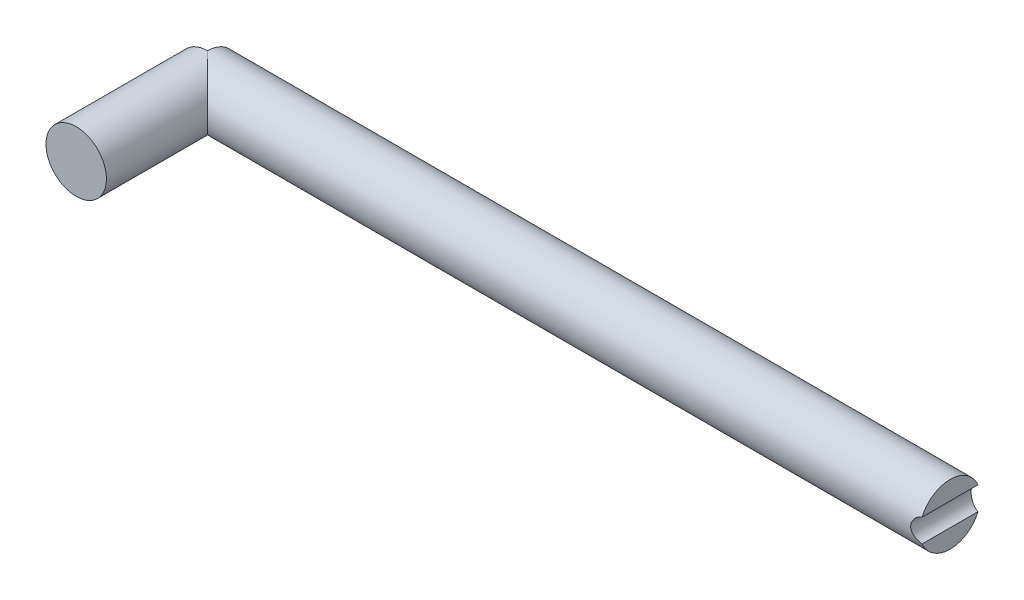
ISO-10303-21;
HEADER;
FILE_DESCRIPTION(('STEP AP214'),'2;1');
FILE_NAME('part.step','',(''),(''),'','','');
FILE_SCHEMA(('AUTOMOTIVE_DESIGN { 1 0 10303 214 1 1 1 1 }'));
ENDSEC;
DATA;
#1=APPLICATION_CONTEXT('core data for automotive mechanical design processes');
#2=APPLICATION_PROTOCOL_DEFINITION('international standard','automotive_design',2000,#1);
#3=PRODUCT_CONTEXT('',#1,'mechanical');
#4=PRODUCT('Part','Part','',(#3));
#5=PRODUCT_RELATED_PRODUCT_CATEGORY('part','',(#4));
#6=PRODUCT_DEFINITION_FORMATION('','',#4);
#7=PRODUCT_DEFINITION_CONTEXT('part definition',#1,'design');
#8=PRODUCT_DEFINITION('design','',#6,#7);
#9=PRODUCT_DEFINITION_SHAPE('','',#8);
#10=(LENGTH_UNIT() NAMED_UNIT(*) SI_UNIT(.MILLI.,.METRE.));
#11=(NAMED_UNIT(*) PLANE_ANGLE_UNIT() SI_UNIT($,.RADIAN.));
#12=(NAMED_UNIT(*) SI_UNIT($,.STERADIAN.) SOLID_ANGLE_UNIT());
#13=UNCERTAINTY_MEASURE_WITH_UNIT(LENGTH_MEASURE(1.E-05),#10,'distance_accuracy_value','');
#14=(GEOMETRIC_REPRESENTATION_CONTEXT(3) GLOBAL_UNCERTAINTY_ASSIGNED_CONTEXT((#13)) GLOBAL_UNIT_ASSIGNED_CONTEXT((#10,
#11,#12)) REPRESENTATION_CONTEXT('',''));
#15=CARTESIAN_POINT('',(0.,0.,0.));
#16=DIRECTION('',(0.,0.,1.));
#17=DIRECTION('',(1.,0.,0.));
#18=AXIS2_PLACEMENT_3D('',#15,#16,#17);
#19=CARTESIAN_POINT('',(565.,0.,0.));
#20=DIRECTION('',(-1.,0.,0.));
#21=DIRECTION('',(0.,0.,1.));
#22=AXIS2_PLACEMENT_3D('',#19,#20,#21);
#23=CYLINDRICAL_SURFACE('',#22,23.);
#24=CARTESIAN_POINT('',(0.,0.,0.));
#25=DIRECTION('',(-0.707106781186547,0.,0.707106781186547));
#26=DIRECTION('',(-0.707106781186547,0.,-0.707106781186547));
#27=AXIS2_PLACEMENT_3D('',#24,#25,#26);
#28=ELLIPSE('',#27,32.5269119345812,23.);
#29=CARTESIAN_POINT('',(0.,-23.,0.));
#30=VERTEX_POINT('',#29);
#31=CARTESIAN_POINT('',(0.,23.,0.));
#32=VERTEX_POINT('',#31);
#33=EDGE_CURVE('E81',#30,#32,#28,.T.);
#34=ORIENTED_EDGE('',*,*,#33,.F.);
#35=CARTESIAN_POINT('',(0.,0.,0.));
#36=DIRECTION('',(1.,0.,0.));
#37=DIRECTION('',(0.,0.,-1.));
#38=AXIS2_PLACEMENT_3D('',#35,#36,#37);
#39=CIRCLE('',#38,23.);
#40=EDGE_CURVE('E79',#30,#32,#39,.T.);
#41=ORIENTED_EDGE('',*,*,#40,.T.);
#42=EDGE_LOOP('',(#34,#41));
#43=FACE_BOUND('',#42,.T.);
#44=CARTESIAN_POINT('',(565.,-8.83177774327774,21.236753562947));
#45=CARTESIAN_POINT('',(564.751631758851,-8.77355780864955,21.2609411154261));
#46=CARTESIAN_POINT('',(564.506163594028,-8.70490790513002,21.2892346345712));
#47=CARTESIAN_POINT('',(564.022791575723,-8.54760662503701,21.3528894008701));
#48=CARTESIAN_POINT('',(563.784884078797,-8.4589650543499,21.3882471820456));
#49=CARTESIAN_POINT('',(563.318734290578,-8.26272576785685,21.4648163787728));
#50=CARTESIAN_POINT('',(563.090469335564,-8.1551759681116,21.5060129480534));
#51=CARTESIAN_POINT('',(562.644346482659,-7.92186711084832,21.5930437221196));
#52=CARTESIAN_POINT('',(562.42648974407,-7.7961060311566,21.6388784417532));
#53=CARTESIAN_POINT('',(562.002828375489,-7.52754398256879,21.7337598266207));
#54=CARTESIAN_POINT('',(561.797004025371,-7.38477213058012,21.7828009404095));
#55=CARTESIAN_POINT('',(561.398079844108,-7.08291370698792,21.8828155845874));
#56=CARTESIAN_POINT('',(561.204984395543,-6.92382156397889,21.9337897711186));
#57=CARTESIAN_POINT('',(560.832566915405,-6.59023744179139,22.0363160871739));
#58=CARTESIAN_POINT('',(560.653252058117,-6.41573754144253,22.0878685019378));
#59=CARTESIAN_POINT('',(560.309531819447,-6.05239770968698,22.1901802735044));
#60=CARTESIAN_POINT('',(560.145126975128,-5.86355726218063,22.2409396016854));
#61=CARTESIAN_POINT('',(559.826190455125,-5.46502392949975,22.3422781835907));
#62=CARTESIAN_POINT('',(559.672286125055,-5.25480714852089,22.3927746236614));
#63=CARTESIAN_POINT('',(559.382835620718,-4.82139600093398,22.4900743289765));
#64=CARTESIAN_POINT('',(559.247282629288,-4.59820649771998,22.5368789629426));
#65=CARTESIAN_POINT('',(558.995571276319,-4.14020927300896,22.6254957511936));
#66=CARTESIAN_POINT('',(558.879411580353,-3.90540235233303,22.6673082489243));
#67=CARTESIAN_POINT('',(558.667528966972,-3.42575678508625,22.7447397747402));
#68=CARTESIAN_POINT('',(558.571805088525,-3.18091861089959,22.7803590940567));
#69=CARTESIAN_POINT('',(558.404454904288,-2.69093152741043,22.8433347485432));
#70=CARTESIAN_POINT('',(558.33215824539,-2.4460408400798,22.8709181100274));
#71=CARTESIAN_POINT('',(558.208349075951,-1.95033246701191,22.9185119120335));
#72=CARTESIAN_POINT('',(558.156836220819,-1.69951487961443,22.9385224781105));
#73=CARTESIAN_POINT('',(558.075172446681,-1.19400722519765,22.9703822125134));
#74=CARTESIAN_POINT('',(558.045013478391,-0.939318654352761,22.9822344560478));
#75=CARTESIAN_POINT('',(558.006372182166,-0.428054087629004,22.9974381372382));
#76=CARTESIAN_POINT('',(557.997888795177,-0.171478184578307,23.0007899902178));
#77=CARTESIAN_POINT('',(558.002542657474,0.325476594805685,22.9989549649301));
#78=CARTESIAN_POINT('',(558.014368663245,0.565870839816723,22.9942859360369));
#79=CARTESIAN_POINT('',(558.057043519532,1.04469309931983,22.9775106766532));
#80=CARTESIAN_POINT('',(558.087891471246,1.28312120617406,22.9654047975598));
#81=CARTESIAN_POINT('',(558.168300738171,1.75631449759641,22.9340704785625));
#82=CARTESIAN_POINT('',(558.21786173627,1.99107974416532,22.9148421593559));
#83=CARTESIAN_POINT('',(558.335224106901,2.45535221589369,22.8697539710555));
#84=CARTESIAN_POINT('',(558.403025814807,2.68485934429262,22.8438939800314));
#85=CARTESIAN_POINT('',(558.556094451926,3.13663590346848,22.7862516837136));
#86=CARTESIAN_POINT('',(558.641323195293,3.35891994774001,22.7544823404159));
#87=CARTESIAN_POINT('',(558.828663911682,3.79550407378686,22.6857445178547));
#88=CARTESIAN_POINT('',(558.930781587483,4.00980142869627,22.6487742830719));
#89=CARTESIAN_POINT('',(559.151120693167,4.4291450746624,22.5705156484914));
#90=CARTESIAN_POINT('',(559.269343595399,4.63419051762057,22.529226853969));
#91=CARTESIAN_POINT('',(559.521082257977,5.03393276897829,22.44329133345));
#92=CARTESIAN_POINT('',(559.65459889381,5.22862898400367,22.3986444152687));
#93=CARTESIAN_POINT('',(559.944535450304,5.61801558856251,22.304268657451));
#94=CARTESIAN_POINT('',(560.101848334894,5.81200666458183,22.2543956088098));
#95=CARTESIAN_POINT('',(560.431676683175,6.1861186001173,22.1533175740573));
#96=CARTESIAN_POINT('',(560.604187901877,6.36624330642393,22.1021129626583));
#97=CARTESIAN_POINT('',(560.96345221218,6.71169073515121,21.9996743163691));
#98=CARTESIAN_POINT('',(561.150205830954,6.87701290917282,21.9484402804594));
#99=CARTESIAN_POINT('',(561.536919040162,7.19189292136034,21.8472888347714));
#100=CARTESIAN_POINT('',(561.736879857554,7.34144929151269,21.7973715479244));
#101=CARTESIAN_POINT('',(562.171978051901,7.63965121278344,21.6947761331643));
#102=CARTESIAN_POINT('',(562.408548054723,7.78632287593001,21.6424139359999));
#103=CARTESIAN_POINT('',(562.894991873453,8.05770275017248,21.5428480407523));
#104=CARTESIAN_POINT('',(563.14486520876,8.18241175399882,21.4956441565059));
#105=CARTESIAN_POINT('',(563.656901362534,8.40898235403076,21.408034502671));
#106=CARTESIAN_POINT('',(563.919100269483,8.51077106100109,21.3676505201939));
#107=CARTESIAN_POINT('',(564.45300225759,8.68991550541043,21.2954058778142));
#108=CARTESIAN_POINT('',(564.724710467248,8.76725782580683,21.2635498998452));
#109=CARTESIAN_POINT('',(565.,8.83177774327774,21.236753562947));
#110=B_SPLINE_CURVE_WITH_KNOTS('',3,(#44,#45,#46,#47,#48,#49,#50,#51,#52,#53,#54,#55,#56,#57,
#58,#59,#60,#61,#62,#63,#64,#65,#66,#67,#68,#69,#70,#71,#72,#73,#74,#75,#76,#77,#78,#79,#80,#81,
#82,#83,#84,#85,#86,#87,#88,#89,#90,#91,#92,#93,#94,#95,#96,#97,#98,#99,#100,#101,#102,#103,
#104,#105,#106,#107,#108,#109),.UNSPECIFIED.,.F.,.F.,(4,2,2,2,2,2,2,2,2,2,2,2,2,2,2,2,2,2,2,2,2,
2,2,2,2,2,2,2,2,2,2,2,4),(0.,0.768398374985054,1.53642066812511,2.3025240264119,
3.06871251785102,3.83360789203819,4.59876525996892,5.36431831363266,6.12989893173139,
6.92507452896006,7.71995391876642,8.51477859144579,9.30956587776821,10.0790414022761,
10.8485041685136,11.6176767334035,12.3868117162946,13.1081341484491,13.8294225001693,
14.5506986294524,15.2719880211024,15.9917135532381,16.7116826084859,17.4317175278872,
18.1517936861426,18.9150145218996,19.6780228571334,20.4410594483467,21.2041670261391,
22.0526503771899,22.901103096408,23.7522170414372,24.6037973000834),.UNSPECIFIED.);
#111=CARTESIAN_POINT('',(565.,-8.83177774327774,21.236753562947));
#112=VERTEX_POINT('',#111);
#113=CARTESIAN_POINT('',(565.,8.83177774327774,21.236753562947));
#114=VERTEX_POINT('',#113);
#115=EDGE_CURVE('E67',#112,#114,#110,.T.);
#116=ORIENTED_EDGE('',*,*,#115,.T.);
#117=CARTESIAN_POINT('',(565.,0.,0.));
#118=DIRECTION('',(1.,0.,0.));
#119=DIRECTION('',(0.,0.,-1.));
#120=AXIS2_PLACEMENT_3D('',#117,#118,#119);
#121=CIRCLE('',#120,23.);
#122=CARTESIAN_POINT('',(565.,8.83177774327774,-21.236753562947));
#123=VERTEX_POINT('',#122);
#124=EDGE_CURVE('E41',#123,#114,#121,.T.);
#125=ORIENTED_EDGE('',*,*,#124,.F.);
#126=CARTESIAN_POINT('',(565.,-8.83177774327774,-21.236753562947));
#127=CARTESIAN_POINT('',(564.751631758851,-8.77355780864955,-21.2609411154261));
#128=CARTESIAN_POINT('',(564.506163594028,-8.70490790513002,-21.2892346345712));
#129=CARTESIAN_POINT('',(564.022791575723,-8.54760662503701,-21.3528894008701));
#130=CARTESIAN_POINT('',(563.784884078797,-8.4589650543499,-21.3882471820456));
#131=CARTESIAN_POINT('',(563.318734290578,-8.26272576785685,-21.4648163787728));
#132=CARTESIAN_POINT('',(563.090469335564,-8.1551759681116,-21.5060129480534));
#133=CARTESIAN_POINT('',(562.644346482659,-7.92186711084832,-21.5930437221196));
#134=CARTESIAN_POINT('',(562.42648974407,-7.7961060311566,-21.6388784417532));
#135=CARTESIAN_POINT('',(562.002828375489,-7.52754398256879,-21.7337598266207));
#136=CARTESIAN_POINT('',(561.797004025371,-7.38477213058012,-21.7828009404095));
#137=CARTESIAN_POINT('',(561.398079844108,-7.08291370698792,-21.8828155845874));
#138=CARTESIAN_POINT('',(561.204984395543,-6.92382156397889,-21.9337897711186));
#139=CARTESIAN_POINT('',(560.832566915405,-6.59023744179139,-22.0363160871739));
#140=CARTESIAN_POINT('',(560.653252058117,-6.41573754144253,-22.0878685019378));
#141=CARTESIAN_POINT('',(560.309531819447,-6.05239770968698,-22.1901802735044));
#142=CARTESIAN_POINT('',(560.145126975128,-5.86355726218063,-22.2409396016854));
#143=CARTESIAN_POINT('',(559.826190455125,-5.46502392949975,-22.3422781835907));
#144=CARTESIAN_POINT('',(559.672286125055,-5.25480714852089,-22.3927746236614));
#145=CARTESIAN_POINT('',(559.382835620718,-4.82139600093398,-22.4900743289765));
#146=CARTESIAN_POINT('',(559.247282629288,-4.59820649771998,-22.5368789629426));
#147=CARTESIAN_POINT('',(558.995571276319,-4.14020927300896,-22.6254957511936));
#148=CARTESIAN_POINT('',(558.879411580353,-3.90540235233303,-22.6673082489243));
#149=CARTESIAN_POINT('',(558.667528966972,-3.42575678508625,-22.7447397747402));
#150=CARTESIAN_POINT('',(558.571805088525,-3.18091861089959,-22.7803590940567));
#151=CARTESIAN_POINT('',(558.404454904288,-2.69093152741043,-22.8433347485432));
#152=CARTESIAN_POINT('',(558.33215824539,-2.4460408400798,-22.8709181100274));
#153=CARTESIAN_POINT('',(558.208349075951,-1.95033246701191,-22.9185119120335));
#154=CARTESIAN_POINT('',(558.156836220819,-1.69951487961443,-22.9385224781105));
#155=CARTESIAN_POINT('',(558.075172446681,-1.19400722519765,-22.9703822125134));
#156=CARTESIAN_POINT('',(558.045013478391,-0.939318654352761,-22.9822344560478));
#157=CARTESIAN_POINT('',(558.006372182166,-0.428054087629004,-22.9974381372382));
#158=CARTESIAN_POINT('',(557.997888795177,-0.171478184578307,-23.0007899902178));
#159=CARTESIAN_POINT('',(558.002542657474,0.325476594805685,-22.9989549649301));
#160=CARTESIAN_POINT('',(558.014368663245,0.565870839816723,-22.9942859360369));
#161=CARTESIAN_POINT('',(558.057043519532,1.04469309931983,-22.9775106766532));
#162=CARTESIAN_POINT('',(558.087891471246,1.28312120617406,-22.9654047975598));
#163=CARTESIAN_POINT('',(558.168300738171,1.75631449759641,-22.9340704785625));
#164=CARTESIAN_POINT('',(558.21786173627,1.99107974416532,-22.9148421593559));
#165=CARTESIAN_POINT('',(558.335224106901,2.45535221589369,-22.8697539710555));
#166=CARTESIAN_POINT('',(558.403025814807,2.68485934429262,-22.8438939800314));
#167=CARTESIAN_POINT('',(558.556094451926,3.13663590346848,-22.7862516837136));
#168=CARTESIAN_POINT('',(558.641323195293,3.35891994774001,-22.7544823404159));
#169=CARTESIAN_POINT('',(558.828663911682,3.79550407378686,-22.6857445178547));
#170=CARTESIAN_POINT('',(558.930781587483,4.00980142869627,-22.6487742830719));
#171=CARTESIAN_POINT('',(559.151120693167,4.4291450746624,-22.5705156484914));
#172=CARTESIAN_POINT('',(559.269343595399,4.63419051762057,-22.529226853969));
#173=CARTESIAN_POINT('',(559.521082257977,5.03393276897829,-22.44329133345));
#174=CARTESIAN_POINT('',(559.65459889381,5.22862898400367,-22.3986444152687));
#175=CARTESIAN_POINT('',(559.944535450304,5.61801558856251,-22.304268657451));
#176=CARTESIAN_POINT('',(560.101848334894,5.81200666458183,-22.2543956088098));
#177=CARTESIAN_POINT('',(560.431676683175,6.1861186001173,-22.1533175740573));
#178=CARTESIAN_POINT('',(560.604187901877,6.36624330642393,-22.1021129626583));
#179=CARTESIAN_POINT('',(560.96345221218,6.71169073515121,-21.9996743163691));
#180=CARTESIAN_POINT('',(561.150205830954,6.87701290917282,-21.9484402804594));
#181=CARTESIAN_POINT('',(561.536919040162,7.19189292136034,-21.8472888347714));
#182=CARTESIAN_POINT('',(561.736879857554,7.34144929151269,-21.7973715479244));
#183=CARTESIAN_POINT('',(562.171978051901,7.63965121278344,-21.6947761331643));
#184=CARTESIAN_POINT('',(562.408548054723,7.78632287593001,-21.6424139359999));
#185=CARTESIAN_POINT('',(562.894991873453,8.05770275017248,-21.5428480407523));
#186=CARTESIAN_POINT('',(563.14486520876,8.18241175399882,-21.4956441565059));
#187=CARTESIAN_POINT('',(563.656901362534,8.40898235403076,-21.408034502671));
#188=CARTESIAN_POINT('',(563.919100269483,8.51077106100109,-21.3676505201939));
#189=CARTESIAN_POINT('',(564.45300225759,8.68991550541043,-21.2954058778142));
#190=CARTESIAN_POINT('',(564.724710467248,8.76725782580683,-21.2635498998452));
#191=CARTESIAN_POINT('',(565.,8.83177774327774,-21.236753562947));
#192=B_SPLINE_CURVE_WITH_KNOTS('',3,(#126,#127,#128,#129,#130,#131,#132,#133,#134,#135,#136,
#137,#138,#139,#140,#141,#142,#143,#144,#145,#146,#147,#148,#149,#150,#151,#152,#153,#154,#155,
#156,#157,#158,#159,#160,#161,#162,#163,#164,#165,#166,#167,#168,#169,#170,#171,#172,#173,#174,
#175,#176,#177,#178,#179,#180,#181,#182,#183,#184,#185,#186,#187,#188,#189,#190,#191),
.UNSPECIFIED.,.F.,.F.,(4,2,2,2,2,2,2,2,2,2,2,2,2,2,2,2,2,2,2,2,2,2,2,2,2,2,2,2,2,2,2,2,4),(0.,
0.768398374985054,1.53642066812511,2.3025240264119,3.06871251785102,3.83360789203819,
4.59876525996892,5.36431831363266,6.12989893173139,6.92507452896006,7.71995391876642,
8.51477859144579,9.30956587776821,10.0790414022761,10.8485041685136,11.6176767334035,
12.3868117162946,13.1081341484491,13.8294225001693,14.5506986294524,15.2719880211024,
15.9917135532381,16.7116826084859,17.4317175278872,18.1517936861426,18.9150145218996,
19.6780228571334,20.4410594483467,21.2041670261391,22.0526503771899,22.901103096408,
23.7522170414372,24.6037973000834),.UNSPECIFIED.);
#193=CARTESIAN_POINT('',(565.,-8.83177774327774,-21.236753562947));
#194=VERTEX_POINT('',#193);
#195=EDGE_CURVE('E48',#194,#123,#192,.T.);
#196=ORIENTED_EDGE('',*,*,#195,.F.);
#197=EDGE_CURVE('E75',#112,#194,#121,.T.);
#198=ORIENTED_EDGE('',*,*,#197,.F.);
#199=EDGE_LOOP('',(#116,#125,#196,#198));
#200=FACE_BOUND('',#199,.T.);
#201=ADVANCED_FACE('F34',(#43,#200),#23,.T.);
#202=CARTESIAN_POINT('',(565.,0.,0.));
#203=DIRECTION('',(1.,0.,0.));
#204=DIRECTION('',(0.,0.,-1.));
#205=AXIS2_PLACEMENT_3D('',#202,#203,#204);
#206=PLANE('',#205);
#207=ORIENTED_EDGE('',*,*,#197,.T.);
#208=DIRECTION('',(0.,0.,-1.));
#209=VECTOR('',#208,1.);
#210=CARTESIAN_POINT('',(565.,-8.83177774327774,100.001));
#211=LINE('',#210,#209);
#212=EDGE_CURVE('E64',#112,#194,#211,.T.);
#213=ORIENTED_EDGE('',*,*,#212,.F.);
#214=EDGE_LOOP('',(#207,#213));
#215=FACE_BOUND('',#214,.T.);
#216=ADVANCED_FACE('F78',(#215),#206,.T.);
#217=ORIENTED_EDGE('',*,*,#124,.T.);
#218=DIRECTION('',(0.,0.,-1.));
#219=VECTOR('',#218,1.);
#220=CARTESIAN_POINT('',(565.,8.83177774327774,100.001));
#221=LINE('',#220,#219);
#222=EDGE_CURVE('E71',#123,#114,#221,.F.);
#223=ORIENTED_EDGE('',*,*,#222,.F.);
#224=EDGE_LOOP('',(#217,#223));
#225=FACE_BOUND('',#224,.T.);
#226=ADVANCED_FACE('F110',(#225),#206,.T.);
#227=CARTESIAN_POINT('',(0.,0.,0.));
#228=DIRECTION('',(1.,0.,0.));
#229=DIRECTION('',(0.,0.,-1.));
#230=AXIS2_PLACEMENT_3D('',#227,#228,#229);
#231=PLANE('',#230);
#232=DIRECTION('',(0.,-1.,0.));
#233=VECTOR('',#232,1.);
#234=CARTESIAN_POINT('',(0.,0.,0.));
#235=LINE('',#234,#233);
#236=EDGE_CURVE('E11',#32,#30,#235,.T.);
#237=ORIENTED_EDGE('',*,*,#236,.F.);
#238=ORIENTED_EDGE('',*,*,#40,.F.);
#239=EDGE_LOOP('',(#237,#238));
#240=FACE_BOUND('',#239,.T.);
#241=ADVANCED_FACE('F112',(#240),#231,.F.);
#242=CARTESIAN_POINT('',(0.,0.,100.));
#243=DIRECTION('',(0.,0.,-1.));
#244=DIRECTION('',(-1.,0.,0.));
#245=AXIS2_PLACEMENT_3D('',#242,#243,#244);
#246=CYLINDRICAL_SURFACE('',#245,23.);
#247=CARTESIAN_POINT('',(0.,0.,100.));
#248=DIRECTION('',(0.,0.,1.));
#249=DIRECTION('',(1.,0.,0.));
#250=AXIS2_PLACEMENT_3D('',#247,#248,#249);
#251=CIRCLE('',#250,23.);
#252=CARTESIAN_POINT('',(23.,0.,100.));
#253=VERTEX_POINT('',#252);
#254=EDGE_CURVE('E85',#253,#253,#251,.T.);
#255=ORIENTED_EDGE('',*,*,#254,.F.);
#256=EDGE_LOOP('',(#255));
#257=FACE_BOUND('',#256,.T.);
#258=CARTESIAN_POINT('',(0.,0.,0.));
#259=DIRECTION('',(0.,0.,1.));
#260=DIRECTION('',(1.,0.,0.));
#261=AXIS2_PLACEMENT_3D('',#258,#259,#260);
#262=CIRCLE('',#261,23.);
#263=EDGE_CURVE('E86',#32,#30,#262,.T.);
#264=ORIENTED_EDGE('',*,*,#263,.T.);
#265=ORIENTED_EDGE('',*,*,#33,.T.);
#266=EDGE_LOOP('',(#264,#265));
#267=FACE_BOUND('',#266,.T.);
#268=ADVANCED_FACE('F118',(#257,#267),#246,.T.);
#269=CARTESIAN_POINT('',(0.,0.,0.));
#270=DIRECTION('',(0.,0.,1.));
#271=DIRECTION('',(1.,0.,0.));
#272=AXIS2_PLACEMENT_3D('',#269,#270,#271);
#273=PLANE('',#272);
#274=ORIENTED_EDGE('',*,*,#263,.F.);
#275=ORIENTED_EDGE('',*,*,#236,.T.);
#276=EDGE_LOOP('',(#274,#275));
#277=FACE_BOUND('',#276,.T.);
#278=ADVANCED_FACE('F128',(#277),#273,.F.);
#279=CARTESIAN_POINT('',(0.,0.,100.));
#280=DIRECTION('',(0.,0.,1.));
#281=DIRECTION('',(1.,0.,0.));
#282=AXIS2_PLACEMENT_3D('',#279,#280,#281);
#283=PLANE('',#282);
#284=ORIENTED_EDGE('',*,*,#254,.T.);
#285=EDGE_LOOP('',(#284));
#286=FACE_BOUND('',#285,.T.);
#287=ADVANCED_FACE('F134',(#286),#283,.T.);
#288=CARTESIAN_POINT('',(567.071310443623,0.,100.001));
#289=DIRECTION('',(0.,0.,-1.));
#290=DIRECTION('',(-1.,0.,0.));
#291=AXIS2_PLACEMENT_3D('',#288,#289,#290);
#292=CYLINDRICAL_SURFACE('',#291,9.07141802920131);
#293=ORIENTED_EDGE('',*,*,#212,.T.);
#294=ORIENTED_EDGE('',*,*,#195,.T.);
#295=ORIENTED_EDGE('',*,*,#222,.T.);
#296=ORIENTED_EDGE('',*,*,#115,.F.);
#297=EDGE_LOOP('',(#293,#294,#295,#296));
#298=FACE_BOUND('',#297,.T.);
#299=ADVANCED_FACE('F65',(#298),#292,.F.);
#300=CLOSED_SHELL('',(#201,#216,#226,#241,#268,#278,#287,#299));
#301=MANIFOLD_SOLID_BREP('B2',#300);
#302=ADVANCED_BREP_SHAPE_REPRESENTATION('',(#18,#301),#14);
#303=SHAPE_DEFINITION_REPRESENTATION(#9,#302);
ENDSEC;
END-ISO-10303-21;
